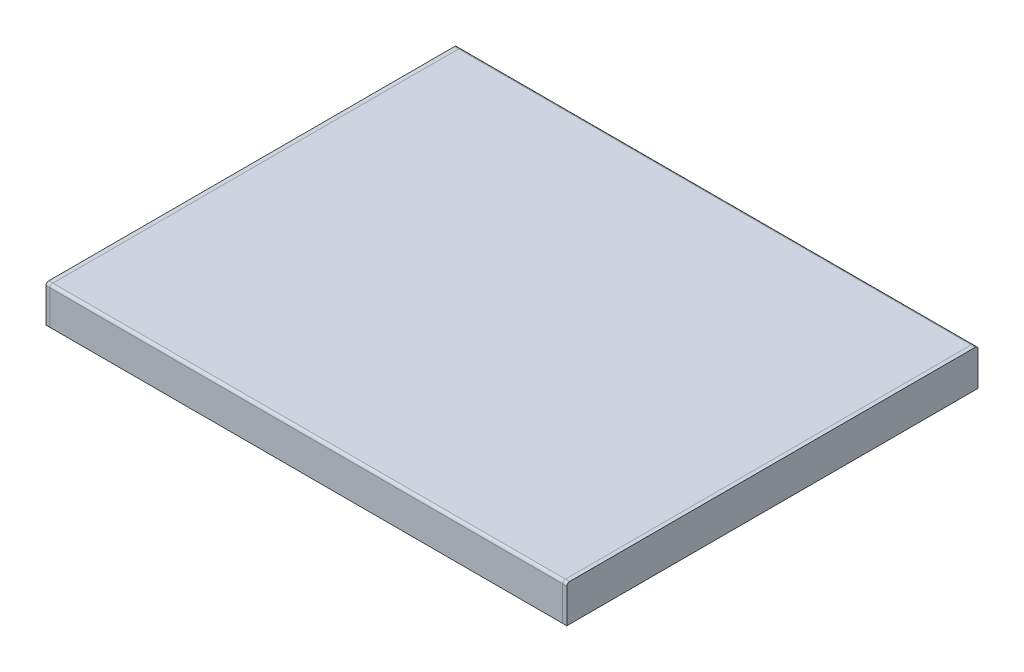
ISO-10303-21;
HEADER;
FILE_DESCRIPTION(('STEP AP214'),'2;1');
FILE_NAME('part.step','',(''),(''),'','','');
FILE_SCHEMA(('AUTOMOTIVE_DESIGN { 1 0 10303 214 1 1 1 1 }'));
ENDSEC;
DATA;
#1=APPLICATION_CONTEXT('core data for automotive mechanical design processes');
#2=APPLICATION_PROTOCOL_DEFINITION('international standard','automotive_design',2000,#1);
#3=PRODUCT_CONTEXT('',#1,'mechanical');
#4=PRODUCT('Part','Part','',(#3));
#5=PRODUCT_RELATED_PRODUCT_CATEGORY('part','',(#4));
#6=PRODUCT_DEFINITION_FORMATION('','',#4);
#7=PRODUCT_DEFINITION_CONTEXT('part definition',#1,'design');
#8=PRODUCT_DEFINITION('design','',#6,#7);
#9=PRODUCT_DEFINITION_SHAPE('','',#8);
#10=(LENGTH_UNIT() NAMED_UNIT(*) SI_UNIT(.MILLI.,.METRE.));
#11=(NAMED_UNIT(*) PLANE_ANGLE_UNIT() SI_UNIT($,.RADIAN.));
#12=(NAMED_UNIT(*) SI_UNIT($,.STERADIAN.) SOLID_ANGLE_UNIT());
#13=UNCERTAINTY_MEASURE_WITH_UNIT(LENGTH_MEASURE(1.E-05),#10,'distance_accuracy_value','');
#14=(GEOMETRIC_REPRESENTATION_CONTEXT(3) GLOBAL_UNCERTAINTY_ASSIGNED_CONTEXT((#13)) GLOBAL_UNIT_ASSIGNED_CONTEXT((#10,
#11,#12)) REPRESENTATION_CONTEXT('',''));
#15=CARTESIAN_POINT('',(0.,0.,0.));
#16=DIRECTION('',(0.,0.,1.));
#17=DIRECTION('',(1.,0.,0.));
#18=AXIS2_PLACEMENT_3D('',#15,#16,#17);
#19=CARTESIAN_POINT('',(190.,27.,-150.));
#20=DIRECTION('',(0.,0.,-1.));
#21=DIRECTION('',(-1.,0.,0.));
#22=AXIS2_PLACEMENT_3D('',#19,#20,#21);
#23=PLANE('',#22);
#24=DIRECTION('',(0.,-1.,0.));
#25=VECTOR('',#24,1.);
#26=CARTESIAN_POINT('',(187.,27.,-150.));
#27=LINE('',#26,#25);
#28=CARTESIAN_POINT('',(187.,25.,-150.));
#29=VERTEX_POINT('',#28);
#30=CARTESIAN_POINT('',(187.,0.,-150.));
#31=VERTEX_POINT('',#30);
#32=EDGE_CURVE('E130',#29,#31,#27,.T.);
#33=ORIENTED_EDGE('',*,*,#32,.F.);
#34=DIRECTION('',(-1.,0.,0.));
#35=VECTOR('',#34,1.);
#36=CARTESIAN_POINT('',(190.,25.,-150.));
#37=LINE('',#36,#35);
#38=CARTESIAN_POINT('',(190.,25.,-150.));
#39=VERTEX_POINT('',#38);
#40=EDGE_CURVE('E12',#39,#29,#37,.T.);
#41=ORIENTED_EDGE('',*,*,#40,.F.);
#42=DIRECTION('',(0.,-1.,0.));
#43=VECTOR('',#42,1.);
#44=CARTESIAN_POINT('',(190.,27.,-150.));
#45=LINE('',#44,#43);
#46=CARTESIAN_POINT('',(190.,0.,-150.));
#47=VERTEX_POINT('',#46);
#48=EDGE_CURVE('E144',#39,#47,#45,.T.);
#49=ORIENTED_EDGE('',*,*,#48,.T.);
#50=DIRECTION('',(-1.,0.,0.));
#51=VECTOR('',#50,1.);
#52=CARTESIAN_POINT('',(190.,0.,-150.));
#53=LINE('',#52,#51);
#54=EDGE_CURVE('E48',#47,#31,#53,.T.);
#55=ORIENTED_EDGE('',*,*,#54,.T.);
#56=EDGE_LOOP('',(#33,#41,#49,#55));
#57=FACE_BOUND('',#56,.T.);
#58=ADVANCED_FACE('F45',(#57),#23,.T.);
#59=CARTESIAN_POINT('',(190.,25.,-148.));
#60=DIRECTION('',(-1.,0.,0.));
#61=DIRECTION('',(0.,0.,1.));
#62=AXIS2_PLACEMENT_3D('',#59,#60,#61);
#63=CYLINDRICAL_SURFACE('',#62,2.);
#64=CARTESIAN_POINT('',(187.,25.,-148.));
#65=DIRECTION('',(-1.,0.,0.));
#66=DIRECTION('',(0.,0.,1.));
#67=AXIS2_PLACEMENT_3D('',#64,#65,#66);
#68=CIRCLE('',#67,2.);
#69=CARTESIAN_POINT('',(187.,27.,-148.));
#70=VERTEX_POINT('',#69);
#71=EDGE_CURVE('E142',#70,#29,#68,.T.);
#72=ORIENTED_EDGE('',*,*,#71,.F.);
#73=DIRECTION('',(-1.,0.,0.));
#74=VECTOR('',#73,1.);
#75=CARTESIAN_POINT('',(190.,27.,-148.));
#76=LINE('',#75,#74);
#77=CARTESIAN_POINT('',(190.,27.,-148.));
#78=VERTEX_POINT('',#77);
#79=EDGE_CURVE('E54',#78,#70,#76,.T.);
#80=ORIENTED_EDGE('',*,*,#79,.F.);
#81=CARTESIAN_POINT('',(190.,25.,-148.));
#82=DIRECTION('',(-1.,0.,0.));
#83=DIRECTION('',(0.,0.,1.));
#84=AXIS2_PLACEMENT_3D('',#81,#82,#83);
#85=CIRCLE('',#84,2.);
#86=EDGE_CURVE('E120',#78,#39,#85,.T.);
#87=ORIENTED_EDGE('',*,*,#86,.T.);
#88=ORIENTED_EDGE('',*,*,#40,.T.);
#89=EDGE_LOOP('',(#72,#80,#87,#88));
#90=FACE_BOUND('',#89,.T.);
#91=ADVANCED_FACE('F152',(#90),#63,.T.);
#92=CARTESIAN_POINT('',(190.,27.,150.));
#93=DIRECTION('',(0.,1.,0.));
#94=DIRECTION('',(0.,0.,1.));
#95=AXIS2_PLACEMENT_3D('',#92,#93,#94);
#96=PLANE('',#95);
#97=DIRECTION('',(0.,0.,-1.));
#98=VECTOR('',#97,1.);
#99=CARTESIAN_POINT('',(187.,27.,150.));
#100=LINE('',#99,#98);
#101=CARTESIAN_POINT('',(187.,27.,148.));
#102=VERTEX_POINT('',#101);
#103=EDGE_CURVE('E107',#102,#70,#100,.T.);
#104=ORIENTED_EDGE('',*,*,#103,.F.);
#105=DIRECTION('',(-1.,0.,0.));
#106=VECTOR('',#105,1.);
#107=CARTESIAN_POINT('',(190.,27.,148.));
#108=LINE('',#107,#106);
#109=CARTESIAN_POINT('',(190.,27.,148.));
#110=VERTEX_POINT('',#109);
#111=EDGE_CURVE('E102',#110,#102,#108,.T.);
#112=ORIENTED_EDGE('',*,*,#111,.F.);
#113=DIRECTION('',(0.,0.,-1.));
#114=VECTOR('',#113,1.);
#115=CARTESIAN_POINT('',(190.,27.,150.));
#116=LINE('',#115,#114);
#117=EDGE_CURVE('E105',#110,#78,#116,.T.);
#118=ORIENTED_EDGE('',*,*,#117,.T.);
#119=ORIENTED_EDGE('',*,*,#79,.T.);
#120=EDGE_LOOP('',(#104,#112,#118,#119));
#121=FACE_BOUND('',#120,.T.);
#122=ADVANCED_FACE('F104',(#121),#96,.T.);
#123=CARTESIAN_POINT('',(190.,25.,148.));
#124=DIRECTION('',(-1.,0.,0.));
#125=DIRECTION('',(0.,0.,1.));
#126=AXIS2_PLACEMENT_3D('',#123,#124,#125);
#127=CYLINDRICAL_SURFACE('',#126,2.);
#128=CARTESIAN_POINT('',(187.,25.,148.));
#129=DIRECTION('',(-1.,0.,0.));
#130=DIRECTION('',(0.,0.,1.));
#131=AXIS2_PLACEMENT_3D('',#128,#129,#130);
#132=CIRCLE('',#131,2.);
#133=CARTESIAN_POINT('',(187.,25.,150.));
#134=VERTEX_POINT('',#133);
#135=EDGE_CURVE('E139',#134,#102,#132,.T.);
#136=ORIENTED_EDGE('',*,*,#135,.F.);
#137=DIRECTION('',(-1.,0.,0.));
#138=VECTOR('',#137,1.);
#139=CARTESIAN_POINT('',(190.,25.,150.));
#140=LINE('',#139,#138);
#141=CARTESIAN_POINT('',(190.,25.,150.));
#142=VERTEX_POINT('',#141);
#143=EDGE_CURVE('E112',#142,#134,#140,.T.);
#144=ORIENTED_EDGE('',*,*,#143,.F.);
#145=CARTESIAN_POINT('',(190.,25.,148.));
#146=DIRECTION('',(-1.,0.,0.));
#147=DIRECTION('',(0.,0.,1.));
#148=AXIS2_PLACEMENT_3D('',#145,#146,#147);
#149=CIRCLE('',#148,2.);
#150=EDGE_CURVE('E118',#142,#110,#149,.T.);
#151=ORIENTED_EDGE('',*,*,#150,.T.);
#152=ORIENTED_EDGE('',*,*,#111,.T.);
#153=EDGE_LOOP('',(#136,#144,#151,#152));
#154=FACE_BOUND('',#153,.T.);
#155=ADVANCED_FACE('F122',(#154),#127,.T.);
#156=CARTESIAN_POINT('',(190.,27.,150.));
#157=DIRECTION('',(0.,0.,1.));
#158=DIRECTION('',(1.,0.,0.));
#159=AXIS2_PLACEMENT_3D('',#156,#157,#158);
#160=PLANE('',#159);
#161=DIRECTION('',(0.,1.,0.));
#162=VECTOR('',#161,1.);
#163=CARTESIAN_POINT('',(187.,27.,150.));
#164=LINE('',#163,#162);
#165=CARTESIAN_POINT('',(187.,0.,150.));
#166=VERTEX_POINT('',#165);
#167=EDGE_CURVE('E136',#166,#134,#164,.T.);
#168=ORIENTED_EDGE('',*,*,#167,.F.);
#169=DIRECTION('',(-1.,0.,0.));
#170=VECTOR('',#169,1.);
#171=CARTESIAN_POINT('',(190.,0.,150.));
#172=LINE('',#171,#170);
#173=CARTESIAN_POINT('',(190.,0.,150.));
#174=VERTEX_POINT('',#173);
#175=EDGE_CURVE('E147',#174,#166,#172,.T.);
#176=ORIENTED_EDGE('',*,*,#175,.F.);
#177=DIRECTION('',(0.,1.,0.));
#178=VECTOR('',#177,1.);
#179=CARTESIAN_POINT('',(190.,27.,150.));
#180=LINE('',#179,#178);
#181=EDGE_CURVE('E123',#174,#142,#180,.T.);
#182=ORIENTED_EDGE('',*,*,#181,.T.);
#183=ORIENTED_EDGE('',*,*,#143,.T.);
#184=EDGE_LOOP('',(#168,#176,#182,#183));
#185=FACE_BOUND('',#184,.T.);
#186=ADVANCED_FACE('F165',(#185),#160,.T.);
#187=CARTESIAN_POINT('',(190.,0.,150.));
#188=DIRECTION('',(0.,-1.,0.));
#189=DIRECTION('',(0.,0.,-1.));
#190=AXIS2_PLACEMENT_3D('',#187,#188,#189);
#191=PLANE('',#190);
#192=DIRECTION('',(0.,0.,1.));
#193=VECTOR('',#192,1.);
#194=CARTESIAN_POINT('',(187.,0.,150.));
#195=LINE('',#194,#193);
#196=EDGE_CURVE('E133',#31,#166,#195,.T.);
#197=ORIENTED_EDGE('',*,*,#196,.F.);
#198=ORIENTED_EDGE('',*,*,#54,.F.);
#199=DIRECTION('',(0.,0.,1.));
#200=VECTOR('',#199,1.);
#201=CARTESIAN_POINT('',(190.,0.,150.));
#202=LINE('',#201,#200);
#203=EDGE_CURVE('E125',#47,#174,#202,.T.);
#204=ORIENTED_EDGE('',*,*,#203,.T.);
#205=ORIENTED_EDGE('',*,*,#175,.T.);
#206=EDGE_LOOP('',(#197,#198,#204,#205));
#207=FACE_BOUND('',#206,.T.);
#208=ADVANCED_FACE('F149',(#207),#191,.T.);
#209=CARTESIAN_POINT('',(190.,25.,148.));
#210=DIRECTION('',(-1.,0.,0.));
#211=DIRECTION('',(0.,0.,1.));
#212=AXIS2_PLACEMENT_3D('',#209,#210,#211);
#213=PLANE('',#212);
#214=ORIENTED_EDGE('',*,*,#48,.F.);
#215=ORIENTED_EDGE('',*,*,#86,.F.);
#216=ORIENTED_EDGE('',*,*,#117,.F.);
#217=ORIENTED_EDGE('',*,*,#150,.F.);
#218=ORIENTED_EDGE('',*,*,#181,.F.);
#219=ORIENTED_EDGE('',*,*,#203,.F.);
#220=EDGE_LOOP('',(#214,#215,#216,#217,#218,#219));
#221=FACE_BOUND('',#220,.T.);
#222=ADVANCED_FACE('F116',(#221),#213,.F.);
#223=CARTESIAN_POINT('',(187.,25.,148.));
#224=DIRECTION('',(-1.,0.,0.));
#225=DIRECTION('',(0.,0.,1.));
#226=AXIS2_PLACEMENT_3D('',#223,#224,#225);
#227=PLANE('',#226);
#228=ORIENTED_EDGE('',*,*,#32,.T.);
#229=ORIENTED_EDGE('',*,*,#196,.T.);
#230=ORIENTED_EDGE('',*,*,#167,.T.);
#231=ORIENTED_EDGE('',*,*,#135,.T.);
#232=ORIENTED_EDGE('',*,*,#103,.T.);
#233=ORIENTED_EDGE('',*,*,#71,.T.);
#234=EDGE_LOOP('',(#228,#229,#230,#231,#232,#233));
#235=FACE_BOUND('',#234,.T.);
#236=ADVANCED_FACE('F151',(#235),#227,.T.);
#237=CLOSED_SHELL('',(#58,#91,#122,#155,#186,#208,#222,#236));
#238=MANIFOLD_SOLID_BREP('B2',#237);
#239=CARTESIAN_POINT('',(-190.,25.,148.));
#240=DIRECTION('',(1.,0.,0.));
#241=DIRECTION('',(0.,0.,-1.));
#242=AXIS2_PLACEMENT_3D('',#239,#240,#241);
#243=CYLINDRICAL_SURFACE('',#242,2.);
#244=CARTESIAN_POINT('',(-187.,25.,148.));
#245=DIRECTION('',(-1.,0.,0.));
#246=DIRECTION('',(0.,0.,1.));
#247=AXIS2_PLACEMENT_3D('',#244,#245,#246);
#248=CIRCLE('',#247,2.);
#249=CARTESIAN_POINT('',(-187.,25.,150.));
#250=VERTEX_POINT('',#249);
#251=CARTESIAN_POINT('',(-187.,27.,148.));
#252=VERTEX_POINT('',#251);
#253=EDGE_CURVE('E312',#250,#252,#248,.T.);
#254=ORIENTED_EDGE('',*,*,#253,.T.);
#255=DIRECTION('',(1.,0.,0.));
#256=VECTOR('',#255,1.);
#257=CARTESIAN_POINT('',(-190.,27.,148.));
#258=LINE('',#257,#256);
#259=CARTESIAN_POINT('',(-190.,27.,148.));
#260=VERTEX_POINT('',#259);
#261=EDGE_CURVE('E43',#260,#252,#258,.T.);
#262=ORIENTED_EDGE('',*,*,#261,.F.);
#263=CARTESIAN_POINT('',(-190.,25.,148.));
#264=DIRECTION('',(-1.,0.,0.));
#265=DIRECTION('',(0.,0.,1.));
#266=AXIS2_PLACEMENT_3D('',#263,#264,#265);
#267=CIRCLE('',#266,2.);
#268=CARTESIAN_POINT('',(-190.,25.,150.));
#269=VERTEX_POINT('',#268);
#270=EDGE_CURVE('E322',#269,#260,#267,.T.);
#271=ORIENTED_EDGE('',*,*,#270,.F.);
#272=DIRECTION('',(1.,0.,0.));
#273=VECTOR('',#272,1.);
#274=CARTESIAN_POINT('',(-190.,25.,150.));
#275=LINE('',#274,#273);
#276=EDGE_CURVE('E308',#269,#250,#275,.T.);
#277=ORIENTED_EDGE('',*,*,#276,.T.);
#278=EDGE_LOOP('',(#254,#262,#271,#277));
#279=FACE_BOUND('',#278,.T.);
#280=ADVANCED_FACE('F228',(#279),#243,.T.);
#281=CARTESIAN_POINT('',(-190.,27.,148.));
#282=DIRECTION('',(0.,-1.,0.));
#283=DIRECTION('',(0.,0.,-1.));
#284=AXIS2_PLACEMENT_3D('',#281,#282,#283);
#285=PLANE('',#284);
#286=DIRECTION('',(0.,0.,-1.));
#287=VECTOR('',#286,1.);
#288=CARTESIAN_POINT('',(-187.,27.,148.));
#289=LINE('',#288,#287);
#290=CARTESIAN_POINT('',(-187.,27.,-148.));
#291=VERTEX_POINT('',#290);
#292=EDGE_CURVE('E315',#252,#291,#289,.T.);
#293=ORIENTED_EDGE('',*,*,#292,.T.);
#294=DIRECTION('',(1.,0.,0.));
#295=VECTOR('',#294,1.);
#296=CARTESIAN_POINT('',(-190.,27.,-148.));
#297=LINE('',#296,#295);
#298=CARTESIAN_POINT('',(-190.,27.,-148.));
#299=VERTEX_POINT('',#298);
#300=EDGE_CURVE('E236',#299,#291,#297,.T.);
#301=ORIENTED_EDGE('',*,*,#300,.F.);
#302=DIRECTION('',(0.,0.,-1.));
#303=VECTOR('',#302,1.);
#304=CARTESIAN_POINT('',(-190.,27.,148.));
#305=LINE('',#304,#303);
#306=EDGE_CURVE('E281',#260,#299,#305,.T.);
#307=ORIENTED_EDGE('',*,*,#306,.F.);
#308=ORIENTED_EDGE('',*,*,#261,.T.);
#309=EDGE_LOOP('',(#293,#301,#307,#308));
#310=FACE_BOUND('',#309,.T.);
#311=ADVANCED_FACE('F346',(#310),#285,.F.);
#312=CARTESIAN_POINT('',(-190.,25.,-148.));
#313=DIRECTION('',(1.,0.,0.));
#314=DIRECTION('',(0.,0.,-1.));
#315=AXIS2_PLACEMENT_3D('',#312,#313,#314);
#316=CYLINDRICAL_SURFACE('',#315,2.);
#317=CARTESIAN_POINT('',(-187.,25.,-148.));
#318=DIRECTION('',(-1.,0.,0.));
#319=DIRECTION('',(0.,0.,1.));
#320=AXIS2_PLACEMENT_3D('',#317,#318,#319);
#321=CIRCLE('',#320,2.);
#322=CARTESIAN_POINT('',(-187.,25.,-150.));
#323=VERTEX_POINT('',#322);
#324=EDGE_CURVE('E317',#291,#323,#321,.T.);
#325=ORIENTED_EDGE('',*,*,#324,.T.);
#326=DIRECTION('',(1.,0.,0.));
#327=VECTOR('',#326,1.);
#328=CARTESIAN_POINT('',(-190.,25.,-150.));
#329=LINE('',#328,#327);
#330=CARTESIAN_POINT('',(-190.,25.,-150.));
#331=VERTEX_POINT('',#330);
#332=EDGE_CURVE('E303',#331,#323,#329,.T.);
#333=ORIENTED_EDGE('',*,*,#332,.F.);
#334=CARTESIAN_POINT('',(-190.,25.,-148.));
#335=DIRECTION('',(-1.,0.,0.));
#336=DIRECTION('',(0.,0.,1.));
#337=AXIS2_PLACEMENT_3D('',#334,#335,#336);
#338=CIRCLE('',#337,2.);
#339=EDGE_CURVE('E294',#299,#331,#338,.T.);
#340=ORIENTED_EDGE('',*,*,#339,.F.);
#341=ORIENTED_EDGE('',*,*,#300,.T.);
#342=EDGE_LOOP('',(#325,#333,#340,#341));
#343=FACE_BOUND('',#342,.T.);
#344=ADVANCED_FACE('F328',(#343),#316,.T.);
#345=CARTESIAN_POINT('',(-190.,25.,-150.));
#346=DIRECTION('',(0.,0.,1.));
#347=DIRECTION('',(1.,0.,0.));
#348=AXIS2_PLACEMENT_3D('',#345,#346,#347);
#349=PLANE('',#348);
#350=DIRECTION('',(0.,-1.,0.));
#351=VECTOR('',#350,1.);
#352=CARTESIAN_POINT('',(-187.,25.,-150.));
#353=LINE('',#352,#351);
#354=CARTESIAN_POINT('',(-187.,0.,-150.));
#355=VERTEX_POINT('',#354);
#356=EDGE_CURVE('E302',#323,#355,#353,.T.);
#357=ORIENTED_EDGE('',*,*,#356,.T.);
#358=DIRECTION('',(1.,0.,0.));
#359=VECTOR('',#358,1.);
#360=CARTESIAN_POINT('',(-190.,0.,-150.));
#361=LINE('',#360,#359);
#362=CARTESIAN_POINT('',(-190.,0.,-150.));
#363=VERTEX_POINT('',#362);
#364=EDGE_CURVE('E299',#363,#355,#361,.T.);
#365=ORIENTED_EDGE('',*,*,#364,.F.);
#366=DIRECTION('',(0.,-1.,0.));
#367=VECTOR('',#366,1.);
#368=CARTESIAN_POINT('',(-190.,25.,-150.));
#369=LINE('',#368,#367);
#370=EDGE_CURVE('E288',#331,#363,#369,.T.);
#371=ORIENTED_EDGE('',*,*,#370,.F.);
#372=ORIENTED_EDGE('',*,*,#332,.T.);
#373=EDGE_LOOP('',(#357,#365,#371,#372));
#374=FACE_BOUND('',#373,.T.);
#375=ADVANCED_FACE('F300',(#374),#349,.F.);
#376=CARTESIAN_POINT('',(-190.,0.,-150.));
#377=DIRECTION('',(0.,1.,0.));
#378=DIRECTION('',(0.,0.,1.));
#379=AXIS2_PLACEMENT_3D('',#376,#377,#378);
#380=PLANE('',#379);
#381=DIRECTION('',(0.,0.,1.));
#382=VECTOR('',#381,1.);
#383=CARTESIAN_POINT('',(-187.,0.,-150.));
#384=LINE('',#383,#382);
#385=CARTESIAN_POINT('',(-187.,0.,150.));
#386=VERTEX_POINT('',#385);
#387=EDGE_CURVE('E267',#355,#386,#384,.T.);
#388=ORIENTED_EDGE('',*,*,#387,.T.);
#389=DIRECTION('',(1.,0.,0.));
#390=VECTOR('',#389,1.);
#391=CARTESIAN_POINT('',(-190.,0.,150.));
#392=LINE('',#391,#390);
#393=CARTESIAN_POINT('',(-190.,0.,150.));
#394=VERTEX_POINT('',#393);
#395=EDGE_CURVE('E304',#394,#386,#392,.T.);
#396=ORIENTED_EDGE('',*,*,#395,.F.);
#397=DIRECTION('',(0.,0.,1.));
#398=VECTOR('',#397,1.);
#399=CARTESIAN_POINT('',(-190.,0.,-150.));
#400=LINE('',#399,#398);
#401=EDGE_CURVE('E292',#363,#394,#400,.T.);
#402=ORIENTED_EDGE('',*,*,#401,.F.);
#403=ORIENTED_EDGE('',*,*,#364,.T.);
#404=EDGE_LOOP('',(#388,#396,#402,#403));
#405=FACE_BOUND('',#404,.T.);
#406=ADVANCED_FACE('F306',(#405),#380,.F.);
#407=CARTESIAN_POINT('',(-190.,0.,150.));
#408=DIRECTION('',(0.,0.,-1.));
#409=DIRECTION('',(-1.,0.,0.));
#410=AXIS2_PLACEMENT_3D('',#407,#408,#409);
#411=PLANE('',#410);
#412=DIRECTION('',(0.,1.,0.));
#413=VECTOR('',#412,1.);
#414=CARTESIAN_POINT('',(-187.,0.,150.));
#415=LINE('',#414,#413);
#416=EDGE_CURVE('E273',#386,#250,#415,.T.);
#417=ORIENTED_EDGE('',*,*,#416,.T.);
#418=ORIENTED_EDGE('',*,*,#276,.F.);
#419=DIRECTION('',(0.,1.,0.));
#420=VECTOR('',#419,1.);
#421=CARTESIAN_POINT('',(-190.,0.,150.));
#422=LINE('',#421,#420);
#423=EDGE_CURVE('E244',#394,#269,#422,.T.);
#424=ORIENTED_EDGE('',*,*,#423,.F.);
#425=ORIENTED_EDGE('',*,*,#395,.T.);
#426=EDGE_LOOP('',(#417,#418,#424,#425));
#427=FACE_BOUND('',#426,.T.);
#428=ADVANCED_FACE('F335',(#427),#411,.F.);
#429=CARTESIAN_POINT('',(-190.,25.,148.));
#430=DIRECTION('',(-1.,0.,0.));
#431=DIRECTION('',(0.,0.,1.));
#432=AXIS2_PLACEMENT_3D('',#429,#430,#431);
#433=PLANE('',#432);
#434=ORIENTED_EDGE('',*,*,#270,.T.);
#435=ORIENTED_EDGE('',*,*,#306,.T.);
#436=ORIENTED_EDGE('',*,*,#339,.T.);
#437=ORIENTED_EDGE('',*,*,#370,.T.);
#438=ORIENTED_EDGE('',*,*,#401,.T.);
#439=ORIENTED_EDGE('',*,*,#423,.T.);
#440=EDGE_LOOP('',(#434,#435,#436,#437,#438,#439));
#441=FACE_BOUND('',#440,.T.);
#442=ADVANCED_FACE('F290',(#441),#433,.T.);
#443=CARTESIAN_POINT('',(-187.,25.,148.));
#444=DIRECTION('',(-1.,0.,0.));
#445=DIRECTION('',(0.,0.,1.));
#446=AXIS2_PLACEMENT_3D('',#443,#444,#445);
#447=PLANE('',#446);
#448=ORIENTED_EDGE('',*,*,#253,.F.);
#449=ORIENTED_EDGE('',*,*,#416,.F.);
#450=ORIENTED_EDGE('',*,*,#387,.F.);
#451=ORIENTED_EDGE('',*,*,#356,.F.);
#452=ORIENTED_EDGE('',*,*,#324,.F.);
#453=ORIENTED_EDGE('',*,*,#292,.F.);
#454=EDGE_LOOP('',(#448,#449,#450,#451,#452,#453));
#455=FACE_BOUND('',#454,.T.);
#456=ADVANCED_FACE('F331',(#455),#447,.F.);
#457=CLOSED_SHELL('',(#280,#311,#344,#375,#406,#428,#442,#456));
#458=MANIFOLD_SOLID_BREP('B6',#457);
#459=CARTESIAN_POINT('',(152.,-7.,-115.));
#460=DIRECTION('',(0.,-1.,0.));
#461=DIRECTION('',(0.,0.,-1.));
#462=AXIS2_PLACEMENT_3D('',#459,#460,#461);
#463=PLANE('',#462);
#464=CARTESIAN_POINT('',(152.,-7.,-115.));
#465=DIRECTION('',(0.,-1.,0.));
#466=DIRECTION('',(0.,0.,-1.));
#467=AXIS2_PLACEMENT_3D('',#464,#465,#466);
#468=CIRCLE('',#467,20.);
#469=CARTESIAN_POINT('',(152.,-7.,-135.));
#470=VERTEX_POINT('',#469);
#471=EDGE_CURVE('E227',#470,#470,#468,.T.);
#472=ORIENTED_EDGE('',*,*,#471,.T.);
#473=EDGE_LOOP('',(#472));
#474=FACE_BOUND('',#473,.T.);
#475=CARTESIAN_POINT('',(152.,-7.,-115.));
#476=DIRECTION('',(0.,-1.,0.));
#477=DIRECTION('',(0.,0.,-1.));
#478=AXIS2_PLACEMENT_3D('',#475,#476,#477);
#479=CIRCLE('',#478,16.);
#480=CARTESIAN_POINT('',(152.,-7.,-131.));
#481=VERTEX_POINT('',#480);
#482=EDGE_CURVE('E424',#481,#481,#479,.T.);
#483=ORIENTED_EDGE('',*,*,#482,.F.);
#484=EDGE_LOOP('',(#483));
#485=FACE_BOUND('',#484,.T.);
#486=ADVANCED_FACE('F411',(#474,#485),#463,.T.);
#487=CARTESIAN_POINT('',(152.,-7.,-115.));
#488=DIRECTION('',(0.,1.,0.));
#489=DIRECTION('',(0.,0.,1.));
#490=AXIS2_PLACEMENT_3D('',#487,#488,#489);
#491=CYLINDRICAL_SURFACE('',#490,20.);
#492=ORIENTED_EDGE('',*,*,#471,.F.);
#493=EDGE_LOOP('',(#492));
#494=FACE_BOUND('',#493,.T.);
#495=CARTESIAN_POINT('',(152.,0.,-115.));
#496=DIRECTION('',(0.,-1.,0.));
#497=DIRECTION('',(0.,0.,-1.));
#498=AXIS2_PLACEMENT_3D('',#495,#496,#497);
#499=CIRCLE('',#498,20.);
#500=CARTESIAN_POINT('',(152.,0.,-135.));
#501=VERTEX_POINT('',#500);
#502=EDGE_CURVE('E415',#501,#501,#499,.T.);
#503=ORIENTED_EDGE('',*,*,#502,.T.);
#504=EDGE_LOOP('',(#503));
#505=FACE_BOUND('',#504,.T.);
#506=ADVANCED_FACE('F413',(#494,#505),#491,.T.);
#507=CARTESIAN_POINT('',(152.,0.,-115.));
#508=DIRECTION('',(0.,-1.,0.));
#509=DIRECTION('',(0.,0.,-1.));
#510=AXIS2_PLACEMENT_3D('',#507,#508,#509);
#511=PLANE('',#510);
#512=ORIENTED_EDGE('',*,*,#502,.F.);
#513=EDGE_LOOP('',(#512));
#514=FACE_BOUND('',#513,.T.);
#515=ADVANCED_FACE('F435',(#514),#511,.F.);
#516=CARTESIAN_POINT('',(152.,-12.,-115.));
#517=DIRECTION('',(0.,1.,0.));
#518=DIRECTION('',(0.,0.,1.));
#519=AXIS2_PLACEMENT_3D('',#516,#517,#518);
#520=CYLINDRICAL_SURFACE('',#519,16.);
#521=CARTESIAN_POINT('',(152.,-12.,-115.));
#522=DIRECTION('',(0.,-1.,0.));
#523=DIRECTION('',(0.,0.,-1.));
#524=AXIS2_PLACEMENT_3D('',#521,#522,#523);
#525=CIRCLE('',#524,16.);
#526=CARTESIAN_POINT('',(152.,-12.,-131.));
#527=VERTEX_POINT('',#526);
#528=EDGE_CURVE('E422',#527,#527,#525,.T.);
#529=ORIENTED_EDGE('',*,*,#528,.F.);
#530=EDGE_LOOP('',(#529));
#531=FACE_BOUND('',#530,.T.);
#532=ORIENTED_EDGE('',*,*,#482,.T.);
#533=EDGE_LOOP('',(#532));
#534=FACE_BOUND('',#533,.T.);
#535=ADVANCED_FACE('F432',(#531,#534),#520,.T.);
#536=CARTESIAN_POINT('',(152.,-12.,-115.));
#537=DIRECTION('',(0.,-1.,0.));
#538=DIRECTION('',(0.,0.,-1.));
#539=AXIS2_PLACEMENT_3D('',#536,#537,#538);
#540=PLANE('',#539);
#541=ORIENTED_EDGE('',*,*,#528,.T.);
#542=EDGE_LOOP('',(#541));
#543=FACE_BOUND('',#542,.T.);
#544=ADVANCED_FACE('F430',(#543),#540,.T.);
#545=CLOSED_SHELL('',(#486,#506,#515,#535,#544));
#546=MANIFOLD_SOLID_BREP('B37',#545);
#547=CARTESIAN_POINT('',(-152.,-7.,-115.));
#548=DIRECTION('',(0.,-1.,0.));
#549=DIRECTION('',(0.,0.,-1.));
#550=AXIS2_PLACEMENT_3D('',#547,#548,#549);
#551=PLANE('',#550);
#552=CARTESIAN_POINT('',(-152.,-7.,-115.));
#553=DIRECTION('',(0.,-1.,0.));
#554=DIRECTION('',(0.,0.,-1.));
#555=AXIS2_PLACEMENT_3D('',#552,#553,#554);
#556=CIRCLE('',#555,20.);
#557=CARTESIAN_POINT('',(-152.,-7.,-135.));
#558=VERTEX_POINT('',#557);
#559=EDGE_CURVE('E410',#558,#558,#556,.T.);
#560=ORIENTED_EDGE('',*,*,#559,.T.);
#561=EDGE_LOOP('',(#560));
#562=FACE_BOUND('',#561,.T.);
#563=CARTESIAN_POINT('',(-152.,-7.,-115.));
#564=DIRECTION('',(0.,-1.,0.));
#565=DIRECTION('',(0.,0.,-1.));
#566=AXIS2_PLACEMENT_3D('',#563,#564,#565);
#567=CIRCLE('',#566,16.);
#568=CARTESIAN_POINT('',(-152.,-7.,-131.));
#569=VERTEX_POINT('',#568);
#570=EDGE_CURVE('E502',#569,#569,#567,.T.);
#571=ORIENTED_EDGE('',*,*,#570,.F.);
#572=EDGE_LOOP('',(#571));
#573=FACE_BOUND('',#572,.T.);
#574=ADVANCED_FACE('F489',(#562,#573),#551,.T.);
#575=CARTESIAN_POINT('',(-152.,-7.,-115.));
#576=DIRECTION('',(0.,1.,0.));
#577=DIRECTION('',(0.,0.,1.));
#578=AXIS2_PLACEMENT_3D('',#575,#576,#577);
#579=CYLINDRICAL_SURFACE('',#578,20.);
#580=ORIENTED_EDGE('',*,*,#559,.F.);
#581=EDGE_LOOP('',(#580));
#582=FACE_BOUND('',#581,.T.);
#583=CARTESIAN_POINT('',(-152.,0.,-115.));
#584=DIRECTION('',(0.,-1.,0.));
#585=DIRECTION('',(0.,0.,-1.));
#586=AXIS2_PLACEMENT_3D('',#583,#584,#585);
#587=CIRCLE('',#586,20.);
#588=CARTESIAN_POINT('',(-152.,0.,-135.));
#589=VERTEX_POINT('',#588);
#590=EDGE_CURVE('E493',#589,#589,#587,.T.);
#591=ORIENTED_EDGE('',*,*,#590,.T.);
#592=EDGE_LOOP('',(#591));
#593=FACE_BOUND('',#592,.T.);
#594=ADVANCED_FACE('F491',(#582,#593),#579,.T.);
#595=CARTESIAN_POINT('',(-152.,0.,-115.));
#596=DIRECTION('',(0.,-1.,0.));
#597=DIRECTION('',(0.,0.,-1.));
#598=AXIS2_PLACEMENT_3D('',#595,#596,#597);
#599=PLANE('',#598);
#600=ORIENTED_EDGE('',*,*,#590,.F.);
#601=EDGE_LOOP('',(#600));
#602=FACE_BOUND('',#601,.T.);
#603=ADVANCED_FACE('F513',(#602),#599,.F.);
#604=CARTESIAN_POINT('',(-152.,-12.,-115.));
#605=DIRECTION('',(0.,1.,0.));
#606=DIRECTION('',(0.,0.,1.));
#607=AXIS2_PLACEMENT_3D('',#604,#605,#606);
#608=CYLINDRICAL_SURFACE('',#607,16.);
#609=CARTESIAN_POINT('',(-152.,-12.,-115.));
#610=DIRECTION('',(0.,-1.,0.));
#611=DIRECTION('',(0.,0.,-1.));
#612=AXIS2_PLACEMENT_3D('',#609,#610,#611);
#613=CIRCLE('',#612,16.);
#614=CARTESIAN_POINT('',(-152.,-12.,-131.));
#615=VERTEX_POINT('',#614);
#616=EDGE_CURVE('E500',#615,#615,#613,.T.);
#617=ORIENTED_EDGE('',*,*,#616,.F.);
#618=EDGE_LOOP('',(#617));
#619=FACE_BOUND('',#618,.T.);
#620=ORIENTED_EDGE('',*,*,#570,.T.);
#621=EDGE_LOOP('',(#620));
#622=FACE_BOUND('',#621,.T.);
#623=ADVANCED_FACE('F510',(#619,#622),#608,.T.);
#624=CARTESIAN_POINT('',(-152.,-12.,-115.));
#625=DIRECTION('',(0.,-1.,0.));
#626=DIRECTION('',(0.,0.,-1.));
#627=AXIS2_PLACEMENT_3D('',#624,#625,#626);
#628=PLANE('',#627);
#629=ORIENTED_EDGE('',*,*,#616,.T.);
#630=EDGE_LOOP('',(#629));
#631=FACE_BOUND('',#630,.T.);
#632=ADVANCED_FACE('F508',(#631),#628,.T.);
#633=CLOSED_SHELL('',(#574,#594,#603,#623,#632));
#634=MANIFOLD_SOLID_BREP('B222',#633);
#635=CARTESIAN_POINT('',(152.,-7.,115.));
#636=DIRECTION('',(0.,-1.,0.));
#637=DIRECTION('',(0.,0.,-1.));
#638=AXIS2_PLACEMENT_3D('',#635,#636,#637);
#639=PLANE('',#638);
#640=CARTESIAN_POINT('',(152.,-7.,115.));
#641=DIRECTION('',(0.,-1.,0.));
#642=DIRECTION('',(0.,0.,-1.));
#643=AXIS2_PLACEMENT_3D('',#640,#641,#642);
#644=CIRCLE('',#643,20.);
#645=CARTESIAN_POINT('',(152.,-7.,95.));
#646=VERTEX_POINT('',#645);
#647=EDGE_CURVE('E488',#646,#646,#644,.T.);
#648=ORIENTED_EDGE('',*,*,#647,.T.);
#649=EDGE_LOOP('',(#648));
#650=FACE_BOUND('',#649,.T.);
#651=CARTESIAN_POINT('',(152.,-7.,115.));
#652=DIRECTION('',(0.,-1.,0.));
#653=DIRECTION('',(0.,0.,-1.));
#654=AXIS2_PLACEMENT_3D('',#651,#652,#653);
#655=CIRCLE('',#654,16.);
#656=CARTESIAN_POINT('',(152.,-7.,99.));
#657=VERTEX_POINT('',#656);
#658=EDGE_CURVE('E580',#657,#657,#655,.T.);
#659=ORIENTED_EDGE('',*,*,#658,.F.);
#660=EDGE_LOOP('',(#659));
#661=FACE_BOUND('',#660,.T.);
#662=ADVANCED_FACE('F567',(#650,#661),#639,.T.);
#663=CARTESIAN_POINT('',(152.,-7.,115.));
#664=DIRECTION('',(0.,1.,0.));
#665=DIRECTION('',(0.,0.,1.));
#666=AXIS2_PLACEMENT_3D('',#663,#664,#665);
#667=CYLINDRICAL_SURFACE('',#666,20.);
#668=ORIENTED_EDGE('',*,*,#647,.F.);
#669=EDGE_LOOP('',(#668));
#670=FACE_BOUND('',#669,.T.);
#671=CARTESIAN_POINT('',(152.,0.,115.));
#672=DIRECTION('',(0.,-1.,0.));
#673=DIRECTION('',(0.,0.,-1.));
#674=AXIS2_PLACEMENT_3D('',#671,#672,#673);
#675=CIRCLE('',#674,20.);
#676=CARTESIAN_POINT('',(152.,0.,95.));
#677=VERTEX_POINT('',#676);
#678=EDGE_CURVE('E571',#677,#677,#675,.T.);
#679=ORIENTED_EDGE('',*,*,#678,.T.);
#680=EDGE_LOOP('',(#679));
#681=FACE_BOUND('',#680,.T.);
#682=ADVANCED_FACE('F569',(#670,#681),#667,.T.);
#683=CARTESIAN_POINT('',(152.,0.,115.));
#684=DIRECTION('',(0.,-1.,0.));
#685=DIRECTION('',(0.,0.,-1.));
#686=AXIS2_PLACEMENT_3D('',#683,#684,#685);
#687=PLANE('',#686);
#688=ORIENTED_EDGE('',*,*,#678,.F.);
#689=EDGE_LOOP('',(#688));
#690=FACE_BOUND('',#689,.T.);
#691=ADVANCED_FACE('F591',(#690),#687,.F.);
#692=CARTESIAN_POINT('',(152.,-12.,115.));
#693=DIRECTION('',(0.,1.,0.));
#694=DIRECTION('',(0.,0.,1.));
#695=AXIS2_PLACEMENT_3D('',#692,#693,#694);
#696=CYLINDRICAL_SURFACE('',#695,16.);
#697=CARTESIAN_POINT('',(152.,-12.,115.));
#698=DIRECTION('',(0.,-1.,0.));
#699=DIRECTION('',(0.,0.,-1.));
#700=AXIS2_PLACEMENT_3D('',#697,#698,#699);
#701=CIRCLE('',#700,16.);
#702=CARTESIAN_POINT('',(152.,-12.,99.));
#703=VERTEX_POINT('',#702);
#704=EDGE_CURVE('E578',#703,#703,#701,.T.);
#705=ORIENTED_EDGE('',*,*,#704,.F.);
#706=EDGE_LOOP('',(#705));
#707=FACE_BOUND('',#706,.T.);
#708=ORIENTED_EDGE('',*,*,#658,.T.);
#709=EDGE_LOOP('',(#708));
#710=FACE_BOUND('',#709,.T.);
#711=ADVANCED_FACE('F588',(#707,#710),#696,.T.);
#712=CARTESIAN_POINT('',(152.,-12.,115.));
#713=DIRECTION('',(0.,-1.,0.));
#714=DIRECTION('',(0.,0.,-1.));
#715=AXIS2_PLACEMENT_3D('',#712,#713,#714);
#716=PLANE('',#715);
#717=ORIENTED_EDGE('',*,*,#704,.T.);
#718=EDGE_LOOP('',(#717));
#719=FACE_BOUND('',#718,.T.);
#720=ADVANCED_FACE('F586',(#719),#716,.T.);
#721=CLOSED_SHELL('',(#662,#682,#691,#711,#720));
#722=MANIFOLD_SOLID_BREP('B405',#721);
#723=CARTESIAN_POINT('',(-152.,-7.,115.));
#724=DIRECTION('',(0.,-1.,0.));
#725=DIRECTION('',(0.,0.,-1.));
#726=AXIS2_PLACEMENT_3D('',#723,#724,#725);
#727=PLANE('',#726);
#728=CARTESIAN_POINT('',(-152.,-7.,115.));
#729=DIRECTION('',(0.,-1.,0.));
#730=DIRECTION('',(0.,0.,-1.));
#731=AXIS2_PLACEMENT_3D('',#728,#729,#730);
#732=CIRCLE('',#731,20.);
#733=CARTESIAN_POINT('',(-152.,-7.,95.));
#734=VERTEX_POINT('',#733);
#735=EDGE_CURVE('E566',#734,#734,#732,.T.);
#736=ORIENTED_EDGE('',*,*,#735,.T.);
#737=EDGE_LOOP('',(#736));
#738=FACE_BOUND('',#737,.T.);
#739=CARTESIAN_POINT('',(-152.,-7.,115.));
#740=DIRECTION('',(0.,-1.,0.));
#741=DIRECTION('',(0.,0.,-1.));
#742=AXIS2_PLACEMENT_3D('',#739,#740,#741);
#743=CIRCLE('',#742,16.);
#744=CARTESIAN_POINT('',(-152.,-7.,99.));
#745=VERTEX_POINT('',#744);
#746=EDGE_CURVE('E659',#745,#745,#743,.T.);
#747=ORIENTED_EDGE('',*,*,#746,.F.);
#748=EDGE_LOOP('',(#747));
#749=FACE_BOUND('',#748,.T.);
#750=ADVANCED_FACE('F646',(#738,#749),#727,.T.);
#751=CARTESIAN_POINT('',(-152.,-7.,115.));
#752=DIRECTION('',(0.,1.,0.));
#753=DIRECTION('',(0.,0.,1.));
#754=AXIS2_PLACEMENT_3D('',#751,#752,#753);
#755=CYLINDRICAL_SURFACE('',#754,20.);
#756=ORIENTED_EDGE('',*,*,#735,.F.);
#757=EDGE_LOOP('',(#756));
#758=FACE_BOUND('',#757,.T.);
#759=CARTESIAN_POINT('',(-152.,0.,115.));
#760=DIRECTION('',(0.,-1.,0.));
#761=DIRECTION('',(0.,0.,-1.));
#762=AXIS2_PLACEMENT_3D('',#759,#760,#761);
#763=CIRCLE('',#762,20.);
#764=CARTESIAN_POINT('',(-152.,0.,95.));
#765=VERTEX_POINT('',#764);
#766=EDGE_CURVE('E650',#765,#765,#763,.T.);
#767=ORIENTED_EDGE('',*,*,#766,.T.);
#768=EDGE_LOOP('',(#767));
#769=FACE_BOUND('',#768,.T.);
#770=ADVANCED_FACE('F648',(#758,#769),#755,.T.);
#771=CARTESIAN_POINT('',(-152.,0.,115.));
#772=DIRECTION('',(0.,-1.,0.));
#773=DIRECTION('',(0.,0.,-1.));
#774=AXIS2_PLACEMENT_3D('',#771,#772,#773);
#775=PLANE('',#774);
#776=ORIENTED_EDGE('',*,*,#766,.F.);
#777=EDGE_LOOP('',(#776));
#778=FACE_BOUND('',#777,.T.);
#779=ADVANCED_FACE('F670',(#778),#775,.F.);
#780=CARTESIAN_POINT('',(-152.,-12.,115.));
#781=DIRECTION('',(0.,1.,0.));
#782=DIRECTION('',(0.,0.,1.));
#783=AXIS2_PLACEMENT_3D('',#780,#781,#782);
#784=CYLINDRICAL_SURFACE('',#783,16.);
#785=CARTESIAN_POINT('',(-152.,-12.,115.));
#786=DIRECTION('',(0.,-1.,0.));
#787=DIRECTION('',(0.,0.,-1.));
#788=AXIS2_PLACEMENT_3D('',#785,#786,#787);
#789=CIRCLE('',#788,16.);
#790=CARTESIAN_POINT('',(-152.,-12.,99.));
#791=VERTEX_POINT('',#790);
#792=EDGE_CURVE('E657',#791,#791,#789,.T.);
#793=ORIENTED_EDGE('',*,*,#792,.F.);
#794=EDGE_LOOP('',(#793));
#795=FACE_BOUND('',#794,.T.);
#796=ORIENTED_EDGE('',*,*,#746,.T.);
#797=EDGE_LOOP('',(#796));
#798=FACE_BOUND('',#797,.T.);
#799=ADVANCED_FACE('F667',(#795,#798),#784,.T.);
#800=CARTESIAN_POINT('',(-152.,-12.,115.));
#801=DIRECTION('',(0.,-1.,0.));
#802=DIRECTION('',(0.,0.,-1.));
#803=AXIS2_PLACEMENT_3D('',#800,#801,#802);
#804=PLANE('',#803);
#805=ORIENTED_EDGE('',*,*,#792,.T.);
#806=EDGE_LOOP('',(#805));
#807=FACE_BOUND('',#806,.T.);
#808=ADVANCED_FACE('F665',(#807),#804,.T.);
#809=CLOSED_SHELL('',(#750,#770,#779,#799,#808));
#810=MANIFOLD_SOLID_BREP('B483',#809);
#811=CARTESIAN_POINT('',(187.,27.,150.));
#812=DIRECTION('',(-1.,0.,0.));
#813=DIRECTION('',(0.,0.,1.));
#814=AXIS2_PLACEMENT_3D('',#811,#812,#813);
#815=PLANE('',#814);
#816=DIRECTION('',(0.,-1.,0.));
#817=VECTOR('',#816,1.);
#818=CARTESIAN_POINT('',(187.,27.,-150.));
#819=LINE('',#818,#817);
#820=CARTESIAN_POINT('',(187.,25.,-150.));
#821=VERTEX_POINT('',#820);
#822=CARTESIAN_POINT('',(187.,0.,-150.));
#823=VERTEX_POINT('',#822);
#824=EDGE_CURVE('E767',#821,#823,#819,.T.);
#825=ORIENTED_EDGE('',*,*,#824,.F.);
#826=CARTESIAN_POINT('',(187.,25.,-148.));
#827=DIRECTION('',(-1.,0.,0.));
#828=DIRECTION('',(0.,0.,1.));
#829=AXIS2_PLACEMENT_3D('',#826,#827,#828);
#830=CIRCLE('',#829,2.);
#831=CARTESIAN_POINT('',(187.,27.,-148.));
#832=VERTEX_POINT('',#831);
#833=EDGE_CURVE('E724',#821,#832,#830,.F.);
#834=ORIENTED_EDGE('',*,*,#833,.T.);
#835=DIRECTION('',(0.,0.,-1.));
#836=VECTOR('',#835,1.);
#837=CARTESIAN_POINT('',(187.,27.,150.));
#838=LINE('',#837,#836);
#839=CARTESIAN_POINT('',(187.,27.,148.));
#840=VERTEX_POINT('',#839);
#841=EDGE_CURVE('E795',#840,#832,#838,.T.);
#842=ORIENTED_EDGE('',*,*,#841,.F.);
#843=CARTESIAN_POINT('',(187.,25.,148.));
#844=DIRECTION('',(-1.,0.,0.));
#845=DIRECTION('',(0.,0.,1.));
#846=AXIS2_PLACEMENT_3D('',#843,#844,#845);
#847=CIRCLE('',#846,2.);
#848=CARTESIAN_POINT('',(187.,25.,150.));
#849=VERTEX_POINT('',#848);
#850=EDGE_CURVE('E731',#840,#849,#847,.F.);
#851=ORIENTED_EDGE('',*,*,#850,.T.);
#852=DIRECTION('',(0.,-1.,0.));
#853=VECTOR('',#852,1.);
#854=CARTESIAN_POINT('',(187.,27.,150.));
#855=LINE('',#854,#853);
#856=CARTESIAN_POINT('',(187.,0.,150.));
#857=VERTEX_POINT('',#856);
#858=EDGE_CURVE('E785',#849,#857,#855,.T.);
#859=ORIENTED_EDGE('',*,*,#858,.T.);
#860=DIRECTION('',(0.,0.,-1.));
#861=VECTOR('',#860,1.);
#862=CARTESIAN_POINT('',(187.,0.,150.));
#863=LINE('',#862,#861);
#864=EDGE_CURVE('E781',#857,#823,#863,.T.);
#865=ORIENTED_EDGE('',*,*,#864,.T.);
#866=EDGE_LOOP('',(#825,#834,#842,#851,#859,#865));
#867=FACE_BOUND('',#866,.T.);
#868=ADVANCED_FACE('F716',(#867),#815,.F.);
#869=CARTESIAN_POINT('',(-187.,27.,-150.));
#870=DIRECTION('',(0.,0.,1.));
#871=DIRECTION('',(1.,0.,0.));
#872=AXIS2_PLACEMENT_3D('',#869,#870,#871);
#873=PLANE('',#872);
#874=DIRECTION('',(0.,-1.,0.));
#875=VECTOR('',#874,1.);
#876=CARTESIAN_POINT('',(-187.,27.,-150.));
#877=LINE('',#876,#875);
#878=CARTESIAN_POINT('',(-187.,25.,-150.));
#879=VERTEX_POINT('',#878);
#880=CARTESIAN_POINT('',(-187.,0.,-150.));
#881=VERTEX_POINT('',#880);
#882=EDGE_CURVE('E775',#879,#881,#877,.T.);
#883=ORIENTED_EDGE('',*,*,#882,.F.);
#884=DIRECTION('',(-1.,0.,0.));
#885=VECTOR('',#884,1.);
#886=CARTESIAN_POINT('',(-187.,25.,-150.));
#887=LINE('',#886,#885);
#888=EDGE_CURVE('E739',#879,#821,#887,.F.);
#889=ORIENTED_EDGE('',*,*,#888,.T.);
#890=ORIENTED_EDGE('',*,*,#824,.T.);
#891=DIRECTION('',(-1.,0.,0.));
#892=VECTOR('',#891,1.);
#893=CARTESIAN_POINT('',(-187.,0.,-150.));
#894=LINE('',#893,#892);
#895=EDGE_CURVE('E770',#823,#881,#894,.T.);
#896=ORIENTED_EDGE('',*,*,#895,.T.);
#897=EDGE_LOOP('',(#883,#889,#890,#896));
#898=FACE_BOUND('',#897,.T.);
#899=ADVANCED_FACE('F769',(#898),#873,.F.);
#900=CARTESIAN_POINT('',(-187.,27.,150.));
#901=DIRECTION('',(1.,0.,0.));
#902=DIRECTION('',(0.,0.,-1.));
#903=AXIS2_PLACEMENT_3D('',#900,#901,#902);
#904=PLANE('',#903);
#905=DIRECTION('',(0.,0.,1.));
#906=VECTOR('',#905,1.);
#907=CARTESIAN_POINT('',(-187.,27.,150.));
#908=LINE('',#907,#906);
#909=CARTESIAN_POINT('',(-187.,27.,-148.));
#910=VERTEX_POINT('',#909);
#911=CARTESIAN_POINT('',(-187.,27.,148.));
#912=VERTEX_POINT('',#911);
#913=EDGE_CURVE('E789',#910,#912,#908,.T.);
#914=ORIENTED_EDGE('',*,*,#913,.F.);
#915=CARTESIAN_POINT('',(-187.,25.,-148.));
#916=DIRECTION('',(1.,0.,0.));
#917=DIRECTION('',(0.,0.,-1.));
#918=AXIS2_PLACEMENT_3D('',#915,#916,#917);
#919=CIRCLE('',#918,2.);
#920=EDGE_CURVE('E807',#910,#879,#919,.F.);
#921=ORIENTED_EDGE('',*,*,#920,.T.);
#922=ORIENTED_EDGE('',*,*,#882,.T.);
#923=DIRECTION('',(0.,0.,1.));
#924=VECTOR('',#923,1.);
#925=CARTESIAN_POINT('',(-187.,0.,150.));
#926=LINE('',#925,#924);
#927=CARTESIAN_POINT('',(-187.,0.,150.));
#928=VERTEX_POINT('',#927);
#929=EDGE_CURVE('E783',#881,#928,#926,.T.);
#930=ORIENTED_EDGE('',*,*,#929,.T.);
#931=DIRECTION('',(0.,-1.,0.));
#932=VECTOR('',#931,1.);
#933=CARTESIAN_POINT('',(-187.,27.,150.));
#934=LINE('',#933,#932);
#935=CARTESIAN_POINT('',(-187.,25.,150.));
#936=VERTEX_POINT('',#935);
#937=EDGE_CURVE('E797',#936,#928,#934,.T.);
#938=ORIENTED_EDGE('',*,*,#937,.F.);
#939=CARTESIAN_POINT('',(-187.,25.,148.));
#940=DIRECTION('',(1.,0.,0.));
#941=DIRECTION('',(0.,0.,-1.));
#942=AXIS2_PLACEMENT_3D('',#939,#940,#941);
#943=CIRCLE('',#942,2.);
#944=EDGE_CURVE('E805',#936,#912,#943,.F.);
#945=ORIENTED_EDGE('',*,*,#944,.T.);
#946=EDGE_LOOP('',(#914,#921,#922,#930,#938,#945));
#947=FACE_BOUND('',#946,.T.);
#948=ADVANCED_FACE('F820',(#947),#904,.F.);
#949=CARTESIAN_POINT('',(-187.,27.,150.));
#950=DIRECTION('',(0.,0.,-1.));
#951=DIRECTION('',(-1.,0.,0.));
#952=AXIS2_PLACEMENT_3D('',#949,#950,#951);
#953=PLANE('',#952);
#954=ORIENTED_EDGE('',*,*,#858,.F.);
#955=DIRECTION('',(1.,0.,0.));
#956=VECTOR('',#955,1.);
#957=CARTESIAN_POINT('',(-187.,25.,150.));
#958=LINE('',#957,#956);
#959=EDGE_CURVE('E644',#849,#936,#958,.F.);
#960=ORIENTED_EDGE('',*,*,#959,.T.);
#961=ORIENTED_EDGE('',*,*,#937,.T.);
#962=DIRECTION('',(1.,0.,0.));
#963=VECTOR('',#962,1.);
#964=CARTESIAN_POINT('',(-187.,0.,150.));
#965=LINE('',#964,#963);
#966=EDGE_CURVE('E793',#928,#857,#965,.T.);
#967=ORIENTED_EDGE('',*,*,#966,.T.);
#968=EDGE_LOOP('',(#954,#960,#961,#967));
#969=FACE_BOUND('',#968,.T.);
#970=ADVANCED_FACE('F826',(#969),#953,.F.);
#971=CARTESIAN_POINT('',(0.,27.,0.));
#972=DIRECTION('',(0.,-1.,0.));
#973=DIRECTION('',(0.,0.,-1.));
#974=AXIS2_PLACEMENT_3D('',#971,#972,#973);
#975=PLANE('',#974);
#976=ORIENTED_EDGE('',*,*,#841,.T.);
#977=DIRECTION('',(-1.,0.,0.));
#978=VECTOR('',#977,1.);
#979=CARTESIAN_POINT('',(0.,27.,-148.));
#980=LINE('',#979,#978);
#981=EDGE_CURVE('E802',#832,#910,#980,.T.);
#982=ORIENTED_EDGE('',*,*,#981,.T.);
#983=ORIENTED_EDGE('',*,*,#913,.T.);
#984=DIRECTION('',(1.,0.,0.));
#985=VECTOR('',#984,1.);
#986=CARTESIAN_POINT('',(0.,27.,148.));
#987=LINE('',#986,#985);
#988=EDGE_CURVE('E774',#912,#840,#987,.T.);
#989=ORIENTED_EDGE('',*,*,#988,.T.);
#990=EDGE_LOOP('',(#976,#982,#983,#989));
#991=FACE_BOUND('',#990,.T.);
#992=ADVANCED_FACE('F814',(#991),#975,.F.);
#993=CARTESIAN_POINT('',(0.,0.,0.));
#994=DIRECTION('',(0.,-1.,0.));
#995=DIRECTION('',(0.,0.,-1.));
#996=AXIS2_PLACEMENT_3D('',#993,#994,#995);
#997=PLANE('',#996);
#998=ORIENTED_EDGE('',*,*,#864,.F.);
#999=ORIENTED_EDGE('',*,*,#966,.F.);
#1000=ORIENTED_EDGE('',*,*,#929,.F.);
#1001=ORIENTED_EDGE('',*,*,#895,.F.);
#1002=EDGE_LOOP('',(#998,#999,#1000,#1001));
#1003=FACE_BOUND('',#1002,.T.);
#1004=ADVANCED_FACE('F779',(#1003),#997,.T.);
#1005=CARTESIAN_POINT('',(0.,25.,-148.));
#1006=DIRECTION('',(-1.,0.,0.));
#1007=DIRECTION('',(0.,0.,1.));
#1008=AXIS2_PLACEMENT_3D('',#1005,#1006,#1007);
#1009=CYLINDRICAL_SURFACE('',#1008,2.);
#1010=ORIENTED_EDGE('',*,*,#833,.F.);
#1011=ORIENTED_EDGE('',*,*,#888,.F.);
#1012=ORIENTED_EDGE('',*,*,#920,.F.);
#1013=ORIENTED_EDGE('',*,*,#981,.F.);
#1014=EDGE_LOOP('',(#1010,#1011,#1012,#1013));
#1015=FACE_BOUND('',#1014,.T.);
#1016=ADVANCED_FACE('F818',(#1015),#1009,.T.);
#1017=CARTESIAN_POINT('',(0.,25.,148.));
#1018=DIRECTION('',(1.,0.,0.));
#1019=DIRECTION('',(0.,0.,-1.));
#1020=AXIS2_PLACEMENT_3D('',#1017,#1018,#1019);
#1021=CYLINDRICAL_SURFACE('',#1020,2.);
#1022=ORIENTED_EDGE('',*,*,#944,.F.);
#1023=ORIENTED_EDGE('',*,*,#959,.F.);
#1024=ORIENTED_EDGE('',*,*,#850,.F.);
#1025=ORIENTED_EDGE('',*,*,#988,.F.);
#1026=EDGE_LOOP('',(#1022,#1023,#1024,#1025));
#1027=FACE_BOUND('',#1026,.T.);
#1028=ADVANCED_FACE('F718',(#1027),#1021,.T.);
#1029=CLOSED_SHELL('',(#868,#899,#948,#970,#992,#1004,#1016,#1028));
#1030=MANIFOLD_SOLID_BREP('B561',#1029);
#1031=ADVANCED_BREP_SHAPE_REPRESENTATION('',(#18,#238,#458,#546,#634,#722,#810,#1030),#14);
#1032=SHAPE_DEFINITION_REPRESENTATION(#9,#1031);
ENDSEC;
END-ISO-10303-21;
